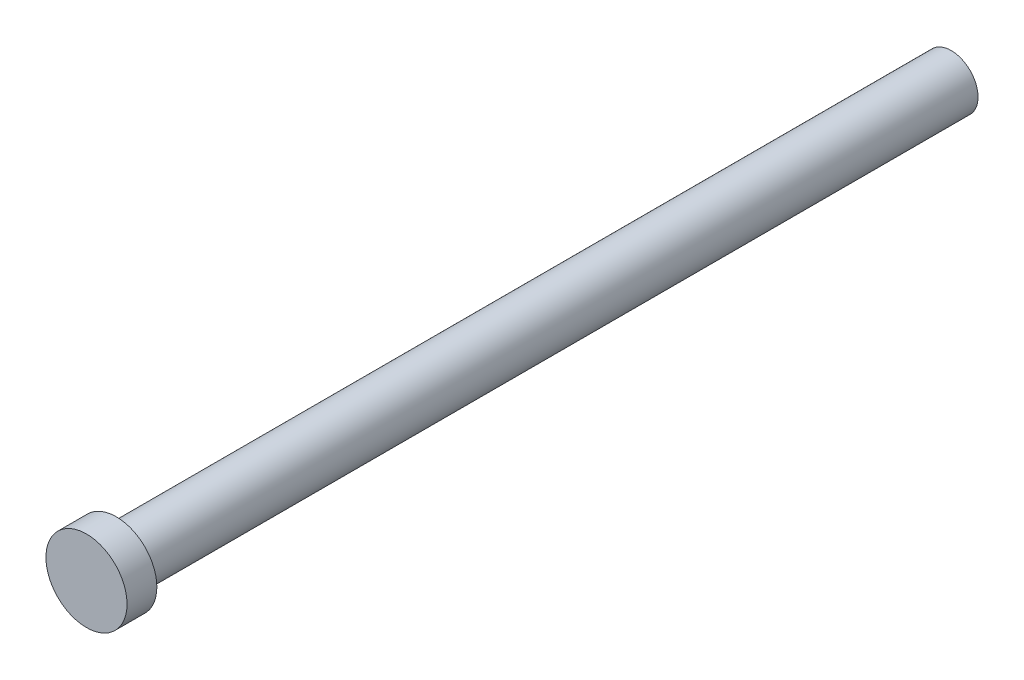
ISO-10303-21;
HEADER;
FILE_DESCRIPTION(('STEP AP214'),'2;1');
FILE_NAME('part.step','',(''),(''),'','','');
FILE_SCHEMA(('AUTOMOTIVE_DESIGN { 1 0 10303 214 1 1 1 1 }'));
ENDSEC;
DATA;
#1=APPLICATION_CONTEXT('core data for automotive mechanical design processes');
#2=APPLICATION_PROTOCOL_DEFINITION('international standard','automotive_design',2000,#1);
#3=PRODUCT_CONTEXT('',#1,'mechanical');
#4=PRODUCT('Part','Part','',(#3));
#5=PRODUCT_RELATED_PRODUCT_CATEGORY('part','',(#4));
#6=PRODUCT_DEFINITION_FORMATION('','',#4);
#7=PRODUCT_DEFINITION_CONTEXT('part definition',#1,'design');
#8=PRODUCT_DEFINITION('design','',#6,#7);
#9=PRODUCT_DEFINITION_SHAPE('','',#8);
#10=(LENGTH_UNIT() NAMED_UNIT(*) SI_UNIT(.MILLI.,.METRE.));
#11=(NAMED_UNIT(*) PLANE_ANGLE_UNIT() SI_UNIT($,.RADIAN.));
#12=(NAMED_UNIT(*) SI_UNIT($,.STERADIAN.) SOLID_ANGLE_UNIT());
#13=UNCERTAINTY_MEASURE_WITH_UNIT(LENGTH_MEASURE(1.E-05),#10,'distance_accuracy_value','');
#14=(GEOMETRIC_REPRESENTATION_CONTEXT(3) GLOBAL_UNCERTAINTY_ASSIGNED_CONTEXT((#13)) GLOBAL_UNIT_ASSIGNED_CONTEXT((#10,
#11,#12)) REPRESENTATION_CONTEXT('',''));
#15=CARTESIAN_POINT('',(0.,0.,0.));
#16=DIRECTION('',(0.,0.,1.));
#17=DIRECTION('',(1.,0.,0.));
#18=AXIS2_PLACEMENT_3D('',#15,#16,#17);
#19=CARTESIAN_POINT('',(0.,0.,1.25));
#20=DIRECTION('',(0.,0.,-1.));
#21=DIRECTION('',(-1.,0.,0.));
#22=AXIS2_PLACEMENT_3D('',#19,#20,#21);
#23=CYLINDRICAL_SURFACE('',#22,1.7);
#24=CARTESIAN_POINT('',(0.,0.,1.25));
#25=DIRECTION('',(0.,0.,1.));
#26=DIRECTION('',(1.,0.,0.));
#27=AXIS2_PLACEMENT_3D('',#24,#25,#26);
#28=CIRCLE('',#27,1.7);
#29=CARTESIAN_POINT('',(1.7,0.,1.25));
#30=VERTEX_POINT('',#29);
#31=EDGE_CURVE('E38',#30,#30,#28,.T.);
#32=ORIENTED_EDGE('',*,*,#31,.F.);
#33=EDGE_LOOP('',(#32));
#34=FACE_BOUND('',#33,.T.);
#35=CARTESIAN_POINT('',(0.,0.,0.));
#36=DIRECTION('',(0.,0.,1.));
#37=DIRECTION('',(1.,0.,0.));
#38=AXIS2_PLACEMENT_3D('',#35,#36,#37);
#39=CIRCLE('',#38,1.7);
#40=CARTESIAN_POINT('',(1.7,0.,0.));
#41=VERTEX_POINT('',#40);
#42=EDGE_CURVE('E34',#41,#41,#39,.T.);
#43=ORIENTED_EDGE('',*,*,#42,.T.);
#44=EDGE_LOOP('',(#43));
#45=FACE_BOUND('',#44,.T.);
#46=ADVANCED_FACE('F31',(#34,#45),#23,.T.);
#47=CARTESIAN_POINT('',(0.,0.,1.25));
#48=DIRECTION('',(0.,0.,1.));
#49=DIRECTION('',(1.,0.,0.));
#50=AXIS2_PLACEMENT_3D('',#47,#48,#49);
#51=PLANE('',#50);
#52=ORIENTED_EDGE('',*,*,#31,.T.);
#53=EDGE_LOOP('',(#52));
#54=FACE_BOUND('',#53,.T.);
#55=ADVANCED_FACE('F55',(#54),#51,.T.);
#56=CARTESIAN_POINT('',(0.,0.,0.));
#57=DIRECTION('',(0.,0.,1.));
#58=DIRECTION('',(1.,0.,0.));
#59=AXIS2_PLACEMENT_3D('',#56,#57,#58);
#60=PLANE('',#59);
#61=CARTESIAN_POINT('',(0.,0.,0.));
#62=DIRECTION('',(0.,0.,-1.));
#63=DIRECTION('',(-1.,0.,0.));
#64=AXIS2_PLACEMENT_3D('',#61,#62,#63);
#65=CIRCLE('',#64,1.125);
#66=CARTESIAN_POINT('',(-1.125,0.,0.));
#67=VERTEX_POINT('',#66);
#68=EDGE_CURVE('E10',#67,#67,#65,.T.);
#69=ORIENTED_EDGE('',*,*,#68,.F.);
#70=EDGE_LOOP('',(#69));
#71=FACE_BOUND('',#70,.T.);
#72=ORIENTED_EDGE('',*,*,#42,.F.);
#73=EDGE_LOOP('',(#72));
#74=FACE_BOUND('',#73,.T.);
#75=ADVANCED_FACE('F52',(#71,#74),#60,.F.);
#76=CARTESIAN_POINT('',(0.,0.,-35.));
#77=DIRECTION('',(0.,0.,1.));
#78=DIRECTION('',(1.,0.,0.));
#79=AXIS2_PLACEMENT_3D('',#76,#77,#78);
#80=CYLINDRICAL_SURFACE('',#79,1.125);
#81=CARTESIAN_POINT('',(0.,0.,-35.));
#82=DIRECTION('',(0.,0.,-1.));
#83=DIRECTION('',(-1.,0.,0.));
#84=AXIS2_PLACEMENT_3D('',#81,#82,#83);
#85=CIRCLE('',#84,1.125);
#86=CARTESIAN_POINT('',(-1.125,0.,-35.));
#87=VERTEX_POINT('',#86);
#88=EDGE_CURVE('E44',#87,#87,#85,.T.);
#89=ORIENTED_EDGE('',*,*,#88,.F.);
#90=EDGE_LOOP('',(#89));
#91=FACE_BOUND('',#90,.T.);
#92=ORIENTED_EDGE('',*,*,#68,.T.);
#93=EDGE_LOOP('',(#92));
#94=FACE_BOUND('',#93,.T.);
#95=ADVANCED_FACE('F54',(#91,#94),#80,.T.);
#96=CARTESIAN_POINT('',(0.,0.,-35.));
#97=DIRECTION('',(0.,0.,-1.));
#98=DIRECTION('',(-1.,0.,0.));
#99=AXIS2_PLACEMENT_3D('',#96,#97,#98);
#100=PLANE('',#99);
#101=ORIENTED_EDGE('',*,*,#88,.T.);
#102=EDGE_LOOP('',(#101));
#103=FACE_BOUND('',#102,.T.);
#104=ADVANCED_FACE('F61',(#103),#100,.T.);
#105=CLOSED_SHELL('',(#46,#55,#75,#95,#104));
#106=MANIFOLD_SOLID_BREP('B2',#105);
#107=ADVANCED_BREP_SHAPE_REPRESENTATION('',(#18,#106),#14);
#108=SHAPE_DEFINITION_REPRESENTATION(#9,#107);
ENDSEC;
END-ISO-10303-21;
